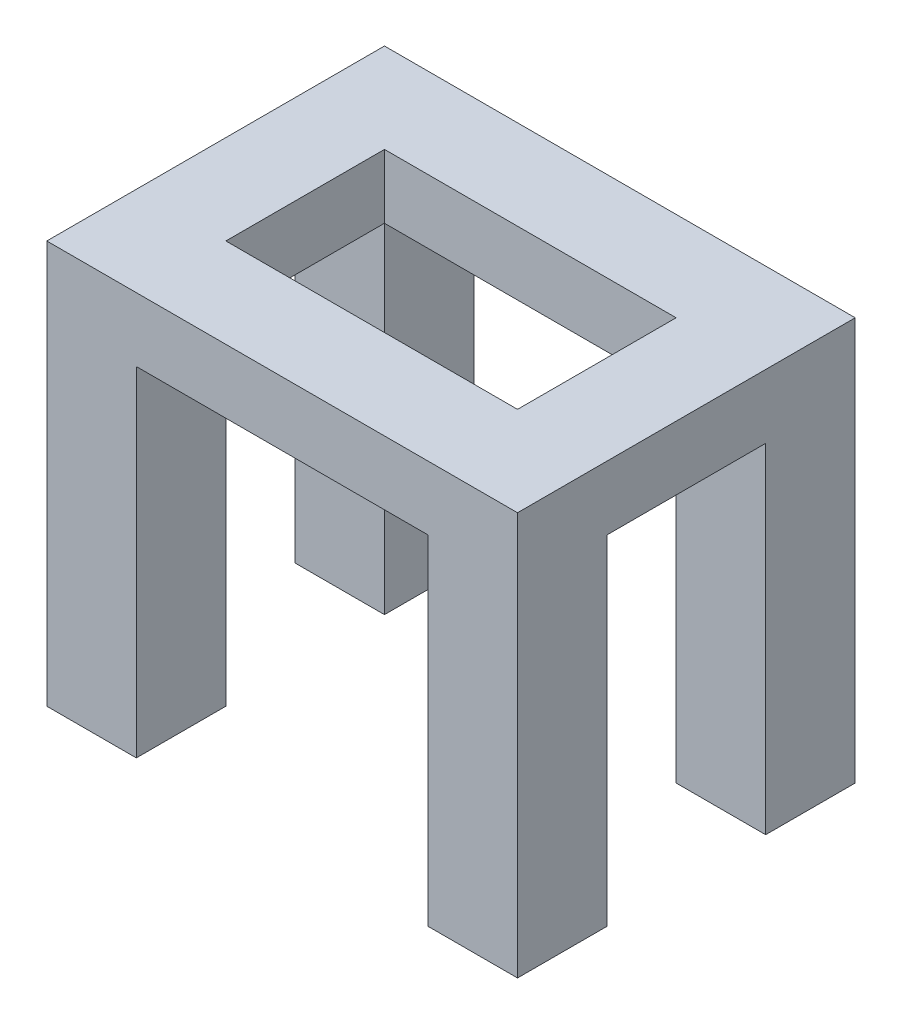
ISO-10303-21;
HEADER;
FILE_DESCRIPTION(('STEP AP214'),'2;1');
FILE_NAME('part.step','',(''),(''),'','','');
FILE_SCHEMA(('AUTOMOTIVE_DESIGN { 1 0 10303 214 1 1 1 1 }'));
ENDSEC;
DATA;
#1=APPLICATION_CONTEXT('core data for automotive mechanical design processes');
#2=APPLICATION_PROTOCOL_DEFINITION('international standard','automotive_design',2000,#1);
#3=PRODUCT_CONTEXT('',#1,'mechanical');
#4=PRODUCT('Part','Part','',(#3));
#5=PRODUCT_RELATED_PRODUCT_CATEGORY('part','',(#4));
#6=PRODUCT_DEFINITION_FORMATION('','',#4);
#7=PRODUCT_DEFINITION_CONTEXT('part definition',#1,'design');
#8=PRODUCT_DEFINITION('design','',#6,#7);
#9=PRODUCT_DEFINITION_SHAPE('','',#8);
#10=(LENGTH_UNIT() NAMED_UNIT(*) SI_UNIT(.MILLI.,.METRE.));
#11=(NAMED_UNIT(*) PLANE_ANGLE_UNIT() SI_UNIT($,.RADIAN.));
#12=(NAMED_UNIT(*) SI_UNIT($,.STERADIAN.) SOLID_ANGLE_UNIT());
#13=UNCERTAINTY_MEASURE_WITH_UNIT(LENGTH_MEASURE(1.E-05),#10,'distance_accuracy_value','');
#14=(GEOMETRIC_REPRESENTATION_CONTEXT(3) GLOBAL_UNCERTAINTY_ASSIGNED_CONTEXT((#13)) GLOBAL_UNIT_ASSIGNED_CONTEXT((#10,
#11,#12)) REPRESENTATION_CONTEXT('',''));
#15=CARTESIAN_POINT('',(0.,0.,0.));
#16=DIRECTION('',(0.,0.,1.));
#17=DIRECTION('',(1.,0.,0.));
#18=AXIS2_PLACEMENT_3D('',#15,#16,#17);
#19=CARTESIAN_POINT('',(0.,0.,0.));
#20=DIRECTION('',(0.,1.,0.));
#21=DIRECTION('',(0.,0.,1.));
#22=AXIS2_PLACEMENT_3D('',#19,#20,#21);
#23=PLANE('',#22);
#24=DIRECTION('',(0.,0.,-1.));
#25=VECTOR('',#24,1.);
#26=CARTESIAN_POINT('',(13.3802816901408,0.,12.1478873239437));
#27=LINE('',#26,#25);
#28=CARTESIAN_POINT('',(13.3802816901408,0.,12.1478873239437));
#29=VERTEX_POINT('',#28);
#30=CARTESIAN_POINT('',(13.3802816901408,0.,5.14788732394366));
#31=VERTEX_POINT('',#30);
#32=EDGE_CURVE('E179',#29,#31,#27,.T.);
#33=ORIENTED_EDGE('',*,*,#32,.F.);
#34=DIRECTION('',(1.,0.,0.));
#35=VECTOR('',#34,1.);
#36=CARTESIAN_POINT('',(-16.4197183098592,0.,12.1478873239437));
#37=LINE('',#36,#35);
#38=CARTESIAN_POINT('',(-9.41971830985915,0.,12.1478873239437));
#39=VERTEX_POINT('',#38);
#40=EDGE_CURVE('E302',#39,#29,#37,.T.);
#41=ORIENTED_EDGE('',*,*,#40,.F.);
#42=DIRECTION('',(0.,0.,1.));
#43=VECTOR('',#42,1.);
#44=CARTESIAN_POINT('',(-9.41971830985915,0.,12.1478873239437));
#45=LINE('',#44,#43);
#46=CARTESIAN_POINT('',(-9.41971830985915,0.,5.14788732394366));
#47=VERTEX_POINT('',#46);
#48=EDGE_CURVE('E195',#47,#39,#45,.T.);
#49=ORIENTED_EDGE('',*,*,#48,.F.);
#50=DIRECTION('',(1.,0.,0.));
#51=VECTOR('',#50,1.);
#52=CARTESIAN_POINT('',(-9.41971830985915,0.,5.14788732394366));
#53=LINE('',#52,#51);
#54=EDGE_CURVE('E271',#47,#31,#53,.T.);
#55=ORIENTED_EDGE('',*,*,#54,.T.);
#56=EDGE_LOOP('',(#33,#41,#49,#55));
#57=FACE_BOUND('',#56,.T.);
#58=ADVANCED_FACE('F33',(#57),#23,.F.);
#59=DIRECTION('',(1.,0.,0.));
#60=VECTOR('',#59,1.);
#61=CARTESIAN_POINT('',(20.3802816901408,0.,5.14788732394366));
#62=LINE('',#61,#60);
#63=CARTESIAN_POINT('',(20.3802816901408,0.,5.14788732394366));
#64=VERTEX_POINT('',#63);
#65=EDGE_CURVE('E177',#31,#64,#62,.T.);
#66=ORIENTED_EDGE('',*,*,#65,.F.);
#67=DIRECTION('',(0.,0.,-1.));
#68=VECTOR('',#67,1.);
#69=CARTESIAN_POINT('',(13.3802816901408,0.,-7.25211267605634));
#70=LINE('',#69,#68);
#71=CARTESIAN_POINT('',(13.3802816901408,0.,-7.25211267605634));
#72=VERTEX_POINT('',#71);
#73=EDGE_CURVE('E274',#31,#72,#70,.T.);
#74=ORIENTED_EDGE('',*,*,#73,.T.);
#75=DIRECTION('',(-1.,0.,0.));
#76=VECTOR('',#75,1.);
#77=CARTESIAN_POINT('',(20.3802816901408,0.,-7.25211267605634));
#78=LINE('',#77,#76);
#79=CARTESIAN_POINT('',(20.3802816901408,0.,-7.25211267605634));
#80=VERTEX_POINT('',#79);
#81=EDGE_CURVE('E232',#80,#72,#78,.T.);
#82=ORIENTED_EDGE('',*,*,#81,.F.);
#83=DIRECTION('',(0.,0.,-1.));
#84=VECTOR('',#83,1.);
#85=CARTESIAN_POINT('',(20.3802816901408,0.,-14.2521126760563));
#86=LINE('',#85,#84);
#87=EDGE_CURVE('E304',#64,#80,#86,.T.);
#88=ORIENTED_EDGE('',*,*,#87,.F.);
#89=EDGE_LOOP('',(#66,#74,#82,#88));
#90=FACE_BOUND('',#89,.T.);
#91=ADVANCED_FACE('F397',(#90),#23,.F.);
#92=DIRECTION('',(1.,0.,0.));
#93=VECTOR('',#92,1.);
#94=CARTESIAN_POINT('',(-16.4197183098592,0.,5.14788732394366));
#95=LINE('',#94,#93);
#96=CARTESIAN_POINT('',(-16.4197183098592,0.,5.14788732394366));
#97=VERTEX_POINT('',#96);
#98=EDGE_CURVE('E190',#97,#47,#95,.T.);
#99=ORIENTED_EDGE('',*,*,#98,.F.);
#100=DIRECTION('',(0.,0.,1.));
#101=VECTOR('',#100,1.);
#102=CARTESIAN_POINT('',(-16.4197183098592,0.,-14.2521126760563));
#103=LINE('',#102,#101);
#104=CARTESIAN_POINT('',(-16.4197183098592,0.,-7.25211267605634));
#105=VERTEX_POINT('',#104);
#106=EDGE_CURVE('E289',#105,#97,#103,.T.);
#107=ORIENTED_EDGE('',*,*,#106,.F.);
#108=DIRECTION('',(-1.,0.,0.));
#109=VECTOR('',#108,1.);
#110=CARTESIAN_POINT('',(-9.41971830985916,0.,-7.25211267605634));
#111=LINE('',#110,#109);
#112=CARTESIAN_POINT('',(-9.41971830985916,0.,-7.25211267605634));
#113=VERTEX_POINT('',#112);
#114=EDGE_CURVE('E215',#113,#105,#111,.T.);
#115=ORIENTED_EDGE('',*,*,#114,.F.);
#116=DIRECTION('',(0.,0.,1.));
#117=VECTOR('',#116,1.);
#118=CARTESIAN_POINT('',(-9.41971830985916,0.,-7.25211267605634));
#119=LINE('',#118,#117);
#120=EDGE_CURVE('E257',#113,#47,#119,.T.);
#121=ORIENTED_EDGE('',*,*,#120,.T.);
#122=EDGE_LOOP('',(#99,#107,#115,#121));
#123=FACE_BOUND('',#122,.T.);
#124=ADVANCED_FACE('F343',(#123),#23,.F.);
#125=DIRECTION('',(0.,0.,1.));
#126=VECTOR('',#125,1.);
#127=CARTESIAN_POINT('',(-9.41971830985916,0.,-7.25211267605634));
#128=LINE('',#127,#126);
#129=CARTESIAN_POINT('',(-9.41971830985916,0.,-14.2521126760563));
#130=VERTEX_POINT('',#129);
#131=EDGE_CURVE('E210',#130,#113,#128,.T.);
#132=ORIENTED_EDGE('',*,*,#131,.F.);
#133=DIRECTION('',(-1.,0.,0.));
#134=VECTOR('',#133,1.);
#135=CARTESIAN_POINT('',(-16.4197183098592,0.,-14.2521126760563));
#136=LINE('',#135,#134);
#137=CARTESIAN_POINT('',(13.3802816901408,0.,-14.2521126760563));
#138=VERTEX_POINT('',#137);
#139=EDGE_CURVE('E294',#138,#130,#136,.T.);
#140=ORIENTED_EDGE('',*,*,#139,.F.);
#141=DIRECTION('',(0.,0.,-1.));
#142=VECTOR('',#141,1.);
#143=CARTESIAN_POINT('',(13.3802816901408,0.,-14.2521126760563));
#144=LINE('',#143,#142);
#145=EDGE_CURVE('E237',#72,#138,#144,.T.);
#146=ORIENTED_EDGE('',*,*,#145,.F.);
#147=DIRECTION('',(-1.,0.,0.));
#148=VECTOR('',#147,1.);
#149=CARTESIAN_POINT('',(-9.41971830985916,0.,-7.25211267605634));
#150=LINE('',#149,#148);
#151=EDGE_CURVE('E261',#72,#113,#150,.T.);
#152=ORIENTED_EDGE('',*,*,#151,.T.);
#153=EDGE_LOOP('',(#132,#140,#146,#152));
#154=FACE_BOUND('',#153,.T.);
#155=ADVANCED_FACE('F333',(#154),#23,.F.);
#156=CARTESIAN_POINT('',(0.,5.,0.));
#157=DIRECTION('',(0.,1.,0.));
#158=DIRECTION('',(0.,0.,1.));
#159=AXIS2_PLACEMENT_3D('',#156,#157,#158);
#160=PLANE('',#159);
#161=DIRECTION('',(0.,0.,1.));
#162=VECTOR('',#161,1.);
#163=CARTESIAN_POINT('',(-16.4197183098592,5.,-14.2521126760563));
#164=LINE('',#163,#162);
#165=CARTESIAN_POINT('',(-16.4197183098592,5.,-14.2521126760563));
#166=VERTEX_POINT('',#165);
#167=CARTESIAN_POINT('',(-16.4197183098592,5.,12.1478873239437));
#168=VERTEX_POINT('',#167);
#169=EDGE_CURVE('E290',#166,#168,#164,.T.);
#170=ORIENTED_EDGE('',*,*,#169,.T.);
#171=DIRECTION('',(1.,0.,0.));
#172=VECTOR('',#171,1.);
#173=CARTESIAN_POINT('',(-16.4197183098592,5.,12.1478873239437));
#174=LINE('',#173,#172);
#175=CARTESIAN_POINT('',(20.3802816901408,5.,12.1478873239437));
#176=VERTEX_POINT('',#175);
#177=EDGE_CURVE('E293',#168,#176,#174,.T.);
#178=ORIENTED_EDGE('',*,*,#177,.T.);
#179=DIRECTION('',(0.,0.,-1.));
#180=VECTOR('',#179,1.);
#181=CARTESIAN_POINT('',(20.3802816901408,5.,-14.2521126760563));
#182=LINE('',#181,#180);
#183=CARTESIAN_POINT('',(20.3802816901408,5.,-14.2521126760563));
#184=VERTEX_POINT('',#183);
#185=EDGE_CURVE('E164',#176,#184,#182,.T.);
#186=ORIENTED_EDGE('',*,*,#185,.T.);
#187=DIRECTION('',(-1.,0.,0.));
#188=VECTOR('',#187,1.);
#189=CARTESIAN_POINT('',(-16.4197183098592,5.,-14.2521126760563));
#190=LINE('',#189,#188);
#191=EDGE_CURVE('E297',#184,#166,#190,.T.);
#192=ORIENTED_EDGE('',*,*,#191,.T.);
#193=EDGE_LOOP('',(#170,#178,#186,#192));
#194=FACE_BOUND('',#193,.T.);
#195=DIRECTION('',(1.,0.,0.));
#196=VECTOR('',#195,1.);
#197=CARTESIAN_POINT('',(-9.41971830985915,5.,5.14788732394366));
#198=LINE('',#197,#196);
#199=CARTESIAN_POINT('',(-9.41971830985915,5.,5.14788732394366));
#200=VERTEX_POINT('',#199);
#201=CARTESIAN_POINT('',(13.3802816901408,5.,5.14788732394366));
#202=VERTEX_POINT('',#201);
#203=EDGE_CURVE('E260',#200,#202,#198,.T.);
#204=ORIENTED_EDGE('',*,*,#203,.F.);
#205=DIRECTION('',(0.,0.,1.));
#206=VECTOR('',#205,1.);
#207=CARTESIAN_POINT('',(-9.41971830985916,5.,-7.25211267605634));
#208=LINE('',#207,#206);
#209=CARTESIAN_POINT('',(-9.41971830985916,5.,-7.25211267605634));
#210=VERTEX_POINT('',#209);
#211=EDGE_CURVE('E258',#210,#200,#208,.T.);
#212=ORIENTED_EDGE('',*,*,#211,.F.);
#213=DIRECTION('',(-1.,0.,0.));
#214=VECTOR('',#213,1.);
#215=CARTESIAN_POINT('',(-9.41971830985916,5.,-7.25211267605634));
#216=LINE('',#215,#214);
#217=CARTESIAN_POINT('',(13.3802816901408,5.,-7.25211267605634));
#218=VERTEX_POINT('',#217);
#219=EDGE_CURVE('E266',#218,#210,#216,.T.);
#220=ORIENTED_EDGE('',*,*,#219,.F.);
#221=DIRECTION('',(0.,0.,-1.));
#222=VECTOR('',#221,1.);
#223=CARTESIAN_POINT('',(13.3802816901408,5.,-7.25211267605634));
#224=LINE('',#223,#222);
#225=EDGE_CURVE('E263',#202,#218,#224,.T.);
#226=ORIENTED_EDGE('',*,*,#225,.F.);
#227=EDGE_LOOP('',(#204,#212,#220,#226));
#228=FACE_BOUND('',#227,.T.);
#229=ADVANCED_FACE('F357',(#194,#228),#160,.T.);
#230=CARTESIAN_POINT('',(-16.4197183098592,5.,-14.2521126760563));
#231=DIRECTION('',(1.,0.,0.));
#232=DIRECTION('',(0.,0.,-1.));
#233=AXIS2_PLACEMENT_3D('',#230,#231,#232);
#234=PLANE('',#233);
#235=DIRECTION('',(0.,-1.,0.));
#236=VECTOR('',#235,1.);
#237=CARTESIAN_POINT('',(-16.4197183098592,5.,-14.2521126760563));
#238=LINE('',#237,#236);
#239=CARTESIAN_POINT('',(-16.4197183098592,-26.5,-14.2521126760563));
#240=VERTEX_POINT('',#239);
#241=EDGE_CURVE('E299',#166,#240,#238,.T.);
#242=ORIENTED_EDGE('',*,*,#241,.T.);
#243=DIRECTION('',(0.,0.,-1.));
#244=VECTOR('',#243,1.);
#245=CARTESIAN_POINT('',(-16.4197183098592,-26.5,-7.25211267605634));
#246=LINE('',#245,#244);
#247=CARTESIAN_POINT('',(-16.4197183098592,-26.5,-7.25211267605634));
#248=VERTEX_POINT('',#247);
#249=EDGE_CURVE('E217',#248,#240,#246,.T.);
#250=ORIENTED_EDGE('',*,*,#249,.F.);
#251=DIRECTION('',(0.,1.,0.));
#252=VECTOR('',#251,1.);
#253=CARTESIAN_POINT('',(-16.4197183098592,-26.5,-7.25211267605634));
#254=LINE('',#253,#252);
#255=EDGE_CURVE('E227',#248,#105,#254,.T.);
#256=ORIENTED_EDGE('',*,*,#255,.T.);
#257=ORIENTED_EDGE('',*,*,#106,.T.);
#258=DIRECTION('',(0.,1.,0.));
#259=VECTOR('',#258,1.);
#260=CARTESIAN_POINT('',(-16.4197183098592,-26.5,5.14788732394366));
#261=LINE('',#260,#259);
#262=CARTESIAN_POINT('',(-16.4197183098592,-26.5,5.14788732394366));
#263=VERTEX_POINT('',#262);
#264=EDGE_CURVE('E208',#263,#97,#261,.T.);
#265=ORIENTED_EDGE('',*,*,#264,.F.);
#266=DIRECTION('',(0.,0.,-1.));
#267=VECTOR('',#266,1.);
#268=CARTESIAN_POINT('',(-16.4197183098592,-26.5,12.1478873239437));
#269=LINE('',#268,#267);
#270=CARTESIAN_POINT('',(-16.4197183098592,-26.5,12.1478873239437));
#271=VERTEX_POINT('',#270);
#272=EDGE_CURVE('E191',#271,#263,#269,.T.);
#273=ORIENTED_EDGE('',*,*,#272,.F.);
#274=DIRECTION('',(0.,-1.,0.));
#275=VECTOR('',#274,1.);
#276=CARTESIAN_POINT('',(-16.4197183098592,5.,12.1478873239437));
#277=LINE('',#276,#275);
#278=EDGE_CURVE('E11',#168,#271,#277,.T.);
#279=ORIENTED_EDGE('',*,*,#278,.F.);
#280=ORIENTED_EDGE('',*,*,#169,.F.);
#281=EDGE_LOOP('',(#242,#250,#256,#257,#265,#273,#279,#280));
#282=FACE_BOUND('',#281,.T.);
#283=ADVANCED_FACE('F35',(#282),#234,.F.);
#284=CARTESIAN_POINT('',(-16.4197183098592,5.,12.1478873239437));
#285=DIRECTION('',(0.,0.,-1.));
#286=DIRECTION('',(-1.,0.,0.));
#287=AXIS2_PLACEMENT_3D('',#284,#285,#286);
#288=PLANE('',#287);
#289=ORIENTED_EDGE('',*,*,#278,.T.);
#290=DIRECTION('',(-1.,0.,0.));
#291=VECTOR('',#290,1.);
#292=CARTESIAN_POINT('',(-16.4197183098592,-26.5,12.1478873239437));
#293=LINE('',#292,#291);
#294=CARTESIAN_POINT('',(-9.41971830985915,-26.5,12.1478873239437));
#295=VERTEX_POINT('',#294);
#296=EDGE_CURVE('E199',#295,#271,#293,.T.);
#297=ORIENTED_EDGE('',*,*,#296,.F.);
#298=DIRECTION('',(0.,1.,0.));
#299=VECTOR('',#298,1.);
#300=CARTESIAN_POINT('',(-9.41971830985915,-26.5,12.1478873239437));
#301=LINE('',#300,#299);
#302=EDGE_CURVE('E56',#295,#39,#301,.T.);
#303=ORIENTED_EDGE('',*,*,#302,.T.);
#304=ORIENTED_EDGE('',*,*,#40,.T.);
#305=DIRECTION('',(0.,1.,0.));
#306=VECTOR('',#305,1.);
#307=CARTESIAN_POINT('',(13.3802816901408,-26.5,12.1478873239437));
#308=LINE('',#307,#306);
#309=CARTESIAN_POINT('',(13.3802816901408,-26.5,12.1478873239437));
#310=VERTEX_POINT('',#309);
#311=EDGE_CURVE('E169',#310,#29,#308,.T.);
#312=ORIENTED_EDGE('',*,*,#311,.F.);
#313=DIRECTION('',(-1.,0.,0.));
#314=VECTOR('',#313,1.);
#315=CARTESIAN_POINT('',(20.3802816901408,-26.5,12.1478873239437));
#316=LINE('',#315,#314);
#317=CARTESIAN_POINT('',(20.3802816901408,-26.5,12.1478873239437));
#318=VERTEX_POINT('',#317);
#319=EDGE_CURVE('E167',#318,#310,#316,.T.);
#320=ORIENTED_EDGE('',*,*,#319,.F.);
#321=DIRECTION('',(0.,-1.,0.));
#322=VECTOR('',#321,1.);
#323=CARTESIAN_POINT('',(20.3802816901408,5.,12.1478873239437));
#324=LINE('',#323,#322);
#325=EDGE_CURVE('E41',#176,#318,#324,.T.);
#326=ORIENTED_EDGE('',*,*,#325,.F.);
#327=ORIENTED_EDGE('',*,*,#177,.F.);
#328=EDGE_LOOP('',(#289,#297,#303,#304,#312,#320,#326,#327));
#329=FACE_BOUND('',#328,.T.);
#330=ADVANCED_FACE('F168',(#329),#288,.F.);
#331=CARTESIAN_POINT('',(20.3802816901408,5.,-14.2521126760563));
#332=DIRECTION('',(-1.,0.,0.));
#333=DIRECTION('',(0.,0.,1.));
#334=AXIS2_PLACEMENT_3D('',#331,#332,#333);
#335=PLANE('',#334);
#336=ORIENTED_EDGE('',*,*,#325,.T.);
#337=DIRECTION('',(0.,0.,1.));
#338=VECTOR('',#337,1.);
#339=CARTESIAN_POINT('',(20.3802816901408,-26.5,12.1478873239437));
#340=LINE('',#339,#338);
#341=CARTESIAN_POINT('',(20.3802816901408,-26.5,5.14788732394366));
#342=VERTEX_POINT('',#341);
#343=EDGE_CURVE('E162',#342,#318,#340,.T.);
#344=ORIENTED_EDGE('',*,*,#343,.F.);
#345=DIRECTION('',(0.,1.,0.));
#346=VECTOR('',#345,1.);
#347=CARTESIAN_POINT('',(20.3802816901408,-26.5,5.14788732394366));
#348=LINE('',#347,#346);
#349=EDGE_CURVE('E48',#342,#64,#348,.T.);
#350=ORIENTED_EDGE('',*,*,#349,.T.);
#351=ORIENTED_EDGE('',*,*,#87,.T.);
#352=DIRECTION('',(0.,1.,0.));
#353=VECTOR('',#352,1.);
#354=CARTESIAN_POINT('',(20.3802816901408,-26.5,-7.25211267605634));
#355=LINE('',#354,#353);
#356=CARTESIAN_POINT('',(20.3802816901408,-26.5,-7.25211267605634));
#357=VERTEX_POINT('',#356);
#358=EDGE_CURVE('E254',#357,#80,#355,.T.);
#359=ORIENTED_EDGE('',*,*,#358,.F.);
#360=DIRECTION('',(0.,0.,1.));
#361=VECTOR('',#360,1.);
#362=CARTESIAN_POINT('',(20.3802816901408,-26.5,-14.2521126760563));
#363=LINE('',#362,#361);
#364=CARTESIAN_POINT('',(20.3802816901408,-26.5,-14.2521126760563));
#365=VERTEX_POINT('',#364);
#366=EDGE_CURVE('E233',#365,#357,#363,.T.);
#367=ORIENTED_EDGE('',*,*,#366,.F.);
#368=DIRECTION('',(0.,-1.,0.));
#369=VECTOR('',#368,1.);
#370=CARTESIAN_POINT('',(20.3802816901408,5.,-14.2521126760563));
#371=LINE('',#370,#369);
#372=EDGE_CURVE('E165',#184,#365,#371,.T.);
#373=ORIENTED_EDGE('',*,*,#372,.F.);
#374=ORIENTED_EDGE('',*,*,#185,.F.);
#375=EDGE_LOOP('',(#336,#344,#350,#351,#359,#367,#373,#374));
#376=FACE_BOUND('',#375,.T.);
#377=ADVANCED_FACE('F160',(#376),#335,.F.);
#378=CARTESIAN_POINT('',(-16.4197183098592,5.,-14.2521126760563));
#379=DIRECTION('',(0.,0.,1.));
#380=DIRECTION('',(1.,0.,0.));
#381=AXIS2_PLACEMENT_3D('',#378,#379,#380);
#382=PLANE('',#381);
#383=ORIENTED_EDGE('',*,*,#372,.T.);
#384=DIRECTION('',(1.,0.,0.));
#385=VECTOR('',#384,1.);
#386=CARTESIAN_POINT('',(20.3802816901408,-26.5,-14.2521126760563));
#387=LINE('',#386,#385);
#388=CARTESIAN_POINT('',(13.3802816901408,-26.5,-14.2521126760563));
#389=VERTEX_POINT('',#388);
#390=EDGE_CURVE('E241',#389,#365,#387,.T.);
#391=ORIENTED_EDGE('',*,*,#390,.F.);
#392=DIRECTION('',(0.,1.,0.));
#393=VECTOR('',#392,1.);
#394=CARTESIAN_POINT('',(13.3802816901408,-26.5,-14.2521126760563));
#395=LINE('',#394,#393);
#396=EDGE_CURVE('E244',#389,#138,#395,.T.);
#397=ORIENTED_EDGE('',*,*,#396,.T.);
#398=ORIENTED_EDGE('',*,*,#139,.T.);
#399=DIRECTION('',(0.,1.,0.));
#400=VECTOR('',#399,1.);
#401=CARTESIAN_POINT('',(-9.41971830985916,-26.5,-14.2521126760563));
#402=LINE('',#401,#400);
#403=CARTESIAN_POINT('',(-9.41971830985916,-26.5,-14.2521126760563));
#404=VERTEX_POINT('',#403);
#405=EDGE_CURVE('E222',#404,#130,#402,.T.);
#406=ORIENTED_EDGE('',*,*,#405,.F.);
#407=DIRECTION('',(1.,0.,0.));
#408=VECTOR('',#407,1.);
#409=CARTESIAN_POINT('',(-9.41971830985916,-26.5,-14.2521126760563));
#410=LINE('',#409,#408);
#411=EDGE_CURVE('E220',#240,#404,#410,.T.);
#412=ORIENTED_EDGE('',*,*,#411,.F.);
#413=ORIENTED_EDGE('',*,*,#241,.F.);
#414=ORIENTED_EDGE('',*,*,#191,.F.);
#415=EDGE_LOOP('',(#383,#391,#397,#398,#406,#412,#413,#414));
#416=FACE_BOUND('',#415,.T.);
#417=ADVANCED_FACE('F312',(#416),#382,.F.);
#418=CARTESIAN_POINT('',(-9.41971830985916,5.,-7.25211267605634));
#419=DIRECTION('',(1.,0.,0.));
#420=DIRECTION('',(0.,0.,-1.));
#421=AXIS2_PLACEMENT_3D('',#418,#419,#420);
#422=PLANE('',#421);
#423=ORIENTED_EDGE('',*,*,#120,.F.);
#424=DIRECTION('',(0.,-1.,0.));
#425=VECTOR('',#424,1.);
#426=CARTESIAN_POINT('',(-9.41971830985916,5.,-7.25211267605634));
#427=LINE('',#426,#425);
#428=EDGE_CURVE('E268',#210,#113,#427,.T.);
#429=ORIENTED_EDGE('',*,*,#428,.F.);
#430=ORIENTED_EDGE('',*,*,#211,.T.);
#431=DIRECTION('',(0.,-1.,0.));
#432=VECTOR('',#431,1.);
#433=CARTESIAN_POINT('',(-9.41971830985915,5.,5.14788732394366));
#434=LINE('',#433,#432);
#435=EDGE_CURVE('E286',#200,#47,#434,.T.);
#436=ORIENTED_EDGE('',*,*,#435,.T.);
#437=EDGE_LOOP('',(#423,#429,#430,#436));
#438=FACE_BOUND('',#437,.T.);
#439=ADVANCED_FACE('F348',(#438),#422,.T.);
#440=CARTESIAN_POINT('',(-9.41971830985915,5.,5.14788732394366));
#441=DIRECTION('',(0.,0.,-1.));
#442=DIRECTION('',(-1.,0.,0.));
#443=AXIS2_PLACEMENT_3D('',#440,#441,#442);
#444=PLANE('',#443);
#445=ORIENTED_EDGE('',*,*,#54,.F.);
#446=ORIENTED_EDGE('',*,*,#435,.F.);
#447=ORIENTED_EDGE('',*,*,#203,.T.);
#448=DIRECTION('',(0.,-1.,0.));
#449=VECTOR('',#448,1.);
#450=CARTESIAN_POINT('',(13.3802816901408,5.,5.14788732394366));
#451=LINE('',#450,#449);
#452=EDGE_CURVE('E283',#202,#31,#451,.T.);
#453=ORIENTED_EDGE('',*,*,#452,.T.);
#454=EDGE_LOOP('',(#445,#446,#447,#453));
#455=FACE_BOUND('',#454,.T.);
#456=ADVANCED_FACE('F360',(#455),#444,.T.);
#457=CARTESIAN_POINT('',(13.3802816901408,5.,-7.25211267605634));
#458=DIRECTION('',(-1.,0.,0.));
#459=DIRECTION('',(0.,0.,1.));
#460=AXIS2_PLACEMENT_3D('',#457,#458,#459);
#461=PLANE('',#460);
#462=ORIENTED_EDGE('',*,*,#73,.F.);
#463=ORIENTED_EDGE('',*,*,#452,.F.);
#464=ORIENTED_EDGE('',*,*,#225,.T.);
#465=DIRECTION('',(0.,-1.,0.));
#466=VECTOR('',#465,1.);
#467=CARTESIAN_POINT('',(13.3802816901408,5.,-7.25211267605634));
#468=LINE('',#467,#466);
#469=EDGE_CURVE('E280',#218,#72,#468,.T.);
#470=ORIENTED_EDGE('',*,*,#469,.T.);
#471=EDGE_LOOP('',(#462,#463,#464,#470));
#472=FACE_BOUND('',#471,.T.);
#473=ADVANCED_FACE('F463',(#472),#461,.T.);
#474=CARTESIAN_POINT('',(-9.41971830985916,5.,-7.25211267605634));
#475=DIRECTION('',(0.,0.,1.));
#476=DIRECTION('',(1.,0.,0.));
#477=AXIS2_PLACEMENT_3D('',#474,#475,#476);
#478=PLANE('',#477);
#479=ORIENTED_EDGE('',*,*,#151,.F.);
#480=ORIENTED_EDGE('',*,*,#469,.F.);
#481=ORIENTED_EDGE('',*,*,#219,.T.);
#482=ORIENTED_EDGE('',*,*,#428,.T.);
#483=EDGE_LOOP('',(#479,#480,#481,#482));
#484=FACE_BOUND('',#483,.T.);
#485=ADVANCED_FACE('F352',(#484),#478,.T.);
#486=CARTESIAN_POINT('',(20.3802816901408,-26.5,-7.25211267605634));
#487=DIRECTION('',(0.,0.,-1.));
#488=DIRECTION('',(-1.,0.,0.));
#489=AXIS2_PLACEMENT_3D('',#486,#487,#488);
#490=PLANE('',#489);
#491=ORIENTED_EDGE('',*,*,#81,.T.);
#492=DIRECTION('',(0.,1.,0.));
#493=VECTOR('',#492,1.);
#494=CARTESIAN_POINT('',(13.3802816901408,-26.5,-7.25211267605634));
#495=LINE('',#494,#493);
#496=CARTESIAN_POINT('',(13.3802816901408,-26.5,-7.25211267605634));
#497=VERTEX_POINT('',#496);
#498=EDGE_CURVE('E251',#497,#72,#495,.T.);
#499=ORIENTED_EDGE('',*,*,#498,.F.);
#500=DIRECTION('',(-1.,0.,0.));
#501=VECTOR('',#500,1.);
#502=CARTESIAN_POINT('',(20.3802816901408,-26.5,-7.25211267605634));
#503=LINE('',#502,#501);
#504=EDGE_CURVE('E236',#357,#497,#503,.T.);
#505=ORIENTED_EDGE('',*,*,#504,.F.);
#506=ORIENTED_EDGE('',*,*,#358,.T.);
#507=EDGE_LOOP('',(#491,#499,#505,#506));
#508=FACE_BOUND('',#507,.T.);
#509=ADVANCED_FACE('F323',(#508),#490,.F.);
#510=CARTESIAN_POINT('',(13.3802816901408,-26.5,-14.2521126760563));
#511=DIRECTION('',(1.,0.,0.));
#512=DIRECTION('',(0.,0.,-1.));
#513=AXIS2_PLACEMENT_3D('',#510,#511,#512);
#514=PLANE('',#513);
#515=ORIENTED_EDGE('',*,*,#145,.T.);
#516=ORIENTED_EDGE('',*,*,#396,.F.);
#517=DIRECTION('',(0.,0.,-1.));
#518=VECTOR('',#517,1.);
#519=CARTESIAN_POINT('',(13.3802816901408,-26.5,-14.2521126760563));
#520=LINE('',#519,#518);
#521=EDGE_CURVE('E239',#497,#389,#520,.T.);
#522=ORIENTED_EDGE('',*,*,#521,.F.);
#523=ORIENTED_EDGE('',*,*,#498,.T.);
#524=EDGE_LOOP('',(#515,#516,#522,#523));
#525=FACE_BOUND('',#524,.T.);
#526=ADVANCED_FACE('F326',(#525),#514,.F.);
#527=CARTESIAN_POINT('',(0.,-26.5,0.));
#528=DIRECTION('',(0.,-1.,0.));
#529=DIRECTION('',(0.,0.,-1.));
#530=AXIS2_PLACEMENT_3D('',#527,#528,#529);
#531=PLANE('',#530);
#532=ORIENTED_EDGE('',*,*,#366,.T.);
#533=ORIENTED_EDGE('',*,*,#504,.T.);
#534=ORIENTED_EDGE('',*,*,#521,.T.);
#535=ORIENTED_EDGE('',*,*,#390,.T.);
#536=EDGE_LOOP('',(#532,#533,#534,#535));
#537=FACE_BOUND('',#536,.T.);
#538=ADVANCED_FACE('F316',(#537),#531,.T.);
#539=CARTESIAN_POINT('',(-9.41971830985916,-26.5,-7.25211267605634));
#540=DIRECTION('',(-1.,0.,0.));
#541=DIRECTION('',(0.,0.,1.));
#542=AXIS2_PLACEMENT_3D('',#539,#540,#541);
#543=PLANE('',#542);
#544=ORIENTED_EDGE('',*,*,#131,.T.);
#545=DIRECTION('',(0.,1.,0.));
#546=VECTOR('',#545,1.);
#547=CARTESIAN_POINT('',(-9.41971830985916,-26.5,-7.25211267605634));
#548=LINE('',#547,#546);
#549=CARTESIAN_POINT('',(-9.41971830985916,-26.5,-7.25211267605634));
#550=VERTEX_POINT('',#549);
#551=EDGE_CURVE('E230',#550,#113,#548,.T.);
#552=ORIENTED_EDGE('',*,*,#551,.F.);
#553=DIRECTION('',(0.,0.,1.));
#554=VECTOR('',#553,1.);
#555=CARTESIAN_POINT('',(-9.41971830985916,-26.5,-7.25211267605634));
#556=LINE('',#555,#554);
#557=EDGE_CURVE('E211',#404,#550,#556,.T.);
#558=ORIENTED_EDGE('',*,*,#557,.F.);
#559=ORIENTED_EDGE('',*,*,#405,.T.);
#560=EDGE_LOOP('',(#544,#552,#558,#559));
#561=FACE_BOUND('',#560,.T.);
#562=ADVANCED_FACE('F338',(#561),#543,.F.);
#563=CARTESIAN_POINT('',(-9.41971830985916,-26.5,-7.25211267605634));
#564=DIRECTION('',(0.,0.,-1.));
#565=DIRECTION('',(-1.,0.,0.));
#566=AXIS2_PLACEMENT_3D('',#563,#564,#565);
#567=PLANE('',#566);
#568=ORIENTED_EDGE('',*,*,#114,.T.);
#569=ORIENTED_EDGE('',*,*,#255,.F.);
#570=DIRECTION('',(-1.,0.,0.));
#571=VECTOR('',#570,1.);
#572=CARTESIAN_POINT('',(-9.41971830985916,-26.5,-7.25211267605634));
#573=LINE('',#572,#571);
#574=EDGE_CURVE('E214',#550,#248,#573,.T.);
#575=ORIENTED_EDGE('',*,*,#574,.F.);
#576=ORIENTED_EDGE('',*,*,#551,.T.);
#577=EDGE_LOOP('',(#568,#569,#575,#576));
#578=FACE_BOUND('',#577,.T.);
#579=ADVANCED_FACE('F377',(#578),#567,.F.);
#580=CARTESIAN_POINT('',(0.,-26.5,0.));
#581=DIRECTION('',(0.,1.,0.));
#582=DIRECTION('',(0.,0.,1.));
#583=AXIS2_PLACEMENT_3D('',#580,#581,#582);
#584=PLANE('',#583);
#585=ORIENTED_EDGE('',*,*,#557,.T.);
#586=ORIENTED_EDGE('',*,*,#574,.T.);
#587=ORIENTED_EDGE('',*,*,#249,.T.);
#588=ORIENTED_EDGE('',*,*,#411,.T.);
#589=EDGE_LOOP('',(#585,#586,#587,#588));
#590=FACE_BOUND('',#589,.T.);
#591=ADVANCED_FACE('F379',(#590),#584,.F.);
#592=CARTESIAN_POINT('',(-16.4197183098592,-26.5,5.14788732394366));
#593=DIRECTION('',(0.,0.,1.));
#594=DIRECTION('',(1.,0.,0.));
#595=AXIS2_PLACEMENT_3D('',#592,#593,#594);
#596=PLANE('',#595);
#597=ORIENTED_EDGE('',*,*,#98,.T.);
#598=DIRECTION('',(0.,1.,0.));
#599=VECTOR('',#598,1.);
#600=CARTESIAN_POINT('',(-9.41971830985915,-26.5,5.14788732394366));
#601=LINE('',#600,#599);
#602=CARTESIAN_POINT('',(-9.41971830985915,-26.5,5.14788732394366));
#603=VERTEX_POINT('',#602);
#604=EDGE_CURVE('E205',#603,#47,#601,.T.);
#605=ORIENTED_EDGE('',*,*,#604,.F.);
#606=DIRECTION('',(1.,0.,0.));
#607=VECTOR('',#606,1.);
#608=CARTESIAN_POINT('',(-16.4197183098592,-26.5,5.14788732394366));
#609=LINE('',#608,#607);
#610=EDGE_CURVE('E194',#263,#603,#609,.T.);
#611=ORIENTED_EDGE('',*,*,#610,.F.);
#612=ORIENTED_EDGE('',*,*,#264,.T.);
#613=EDGE_LOOP('',(#597,#605,#611,#612));
#614=FACE_BOUND('',#613,.T.);
#615=ADVANCED_FACE('F372',(#614),#596,.F.);
#616=CARTESIAN_POINT('',(-9.41971830985915,-26.5,12.1478873239437));
#617=DIRECTION('',(-1.,0.,0.));
#618=DIRECTION('',(0.,0.,1.));
#619=AXIS2_PLACEMENT_3D('',#616,#617,#618);
#620=PLANE('',#619);
#621=ORIENTED_EDGE('',*,*,#48,.T.);
#622=ORIENTED_EDGE('',*,*,#302,.F.);
#623=DIRECTION('',(0.,0.,1.));
#624=VECTOR('',#623,1.);
#625=CARTESIAN_POINT('',(-9.41971830985915,-26.5,12.1478873239437));
#626=LINE('',#625,#624);
#627=EDGE_CURVE('E197',#603,#295,#626,.T.);
#628=ORIENTED_EDGE('',*,*,#627,.F.);
#629=ORIENTED_EDGE('',*,*,#604,.T.);
#630=EDGE_LOOP('',(#621,#622,#628,#629));
#631=FACE_BOUND('',#630,.T.);
#632=ADVANCED_FACE('F368',(#631),#620,.F.);
#633=CARTESIAN_POINT('',(0.,-26.5,0.));
#634=DIRECTION('',(0.,-1.,0.));
#635=DIRECTION('',(0.,0.,-1.));
#636=AXIS2_PLACEMENT_3D('',#633,#634,#635);
#637=PLANE('',#636);
#638=ORIENTED_EDGE('',*,*,#272,.T.);
#639=ORIENTED_EDGE('',*,*,#610,.T.);
#640=ORIENTED_EDGE('',*,*,#627,.T.);
#641=ORIENTED_EDGE('',*,*,#296,.T.);
#642=EDGE_LOOP('',(#638,#639,#640,#641));
#643=FACE_BOUND('',#642,.T.);
#644=ADVANCED_FACE('F384',(#643),#637,.T.);
#645=CARTESIAN_POINT('',(13.3802816901408,-26.5,12.1478873239437));
#646=DIRECTION('',(1.,0.,0.));
#647=DIRECTION('',(0.,0.,-1.));
#648=AXIS2_PLACEMENT_3D('',#645,#646,#647);
#649=PLANE('',#648);
#650=ORIENTED_EDGE('',*,*,#32,.T.);
#651=DIRECTION('',(0.,1.,0.));
#652=VECTOR('',#651,1.);
#653=CARTESIAN_POINT('',(13.3802816901408,-26.5,5.14788732394366));
#654=LINE('',#653,#652);
#655=CARTESIAN_POINT('',(13.3802816901408,-26.5,5.14788732394366));
#656=VERTEX_POINT('',#655);
#657=EDGE_CURVE('E186',#656,#31,#654,.T.);
#658=ORIENTED_EDGE('',*,*,#657,.F.);
#659=DIRECTION('',(0.,0.,-1.));
#660=VECTOR('',#659,1.);
#661=CARTESIAN_POINT('',(13.3802816901408,-26.5,12.1478873239437));
#662=LINE('',#661,#660);
#663=EDGE_CURVE('E172',#310,#656,#662,.T.);
#664=ORIENTED_EDGE('',*,*,#663,.F.);
#665=ORIENTED_EDGE('',*,*,#311,.T.);
#666=EDGE_LOOP('',(#650,#658,#664,#665));
#667=FACE_BOUND('',#666,.T.);
#668=ADVANCED_FACE('F386',(#667),#649,.F.);
#669=CARTESIAN_POINT('',(20.3802816901408,-26.5,5.14788732394366));
#670=DIRECTION('',(0.,0.,1.));
#671=DIRECTION('',(1.,0.,0.));
#672=AXIS2_PLACEMENT_3D('',#669,#670,#671);
#673=PLANE('',#672);
#674=ORIENTED_EDGE('',*,*,#65,.T.);
#675=ORIENTED_EDGE('',*,*,#349,.F.);
#676=DIRECTION('',(1.,0.,0.));
#677=VECTOR('',#676,1.);
#678=CARTESIAN_POINT('',(20.3802816901408,-26.5,5.14788732394366));
#679=LINE('',#678,#677);
#680=EDGE_CURVE('E176',#656,#342,#679,.T.);
#681=ORIENTED_EDGE('',*,*,#680,.F.);
#682=ORIENTED_EDGE('',*,*,#657,.T.);
#683=EDGE_LOOP('',(#674,#675,#681,#682));
#684=FACE_BOUND('',#683,.T.);
#685=ADVANCED_FACE('F392',(#684),#673,.F.);
#686=CARTESIAN_POINT('',(0.,-26.5,0.));
#687=DIRECTION('',(0.,1.,0.));
#688=DIRECTION('',(0.,0.,1.));
#689=AXIS2_PLACEMENT_3D('',#686,#687,#688);
#690=PLANE('',#689);
#691=ORIENTED_EDGE('',*,*,#343,.T.);
#692=ORIENTED_EDGE('',*,*,#319,.T.);
#693=ORIENTED_EDGE('',*,*,#663,.T.);
#694=ORIENTED_EDGE('',*,*,#680,.T.);
#695=EDGE_LOOP('',(#691,#692,#693,#694));
#696=FACE_BOUND('',#695,.T.);
#697=ADVANCED_FACE('F174',(#696),#690,.F.);
#698=CLOSED_SHELL('',(#58,#91,#124,#155,#229,#283,#330,#377,#417,#439,#456,#473,#485,#509,#526,
#538,#562,#579,#591,#615,#632,#644,#668,#685,#697));
#699=MANIFOLD_SOLID_BREP('B2',#698);
#700=ADVANCED_BREP_SHAPE_REPRESENTATION('',(#18,#699),#14);
#701=SHAPE_DEFINITION_REPRESENTATION(#9,#700);
ENDSEC;
END-ISO-10303-21;
